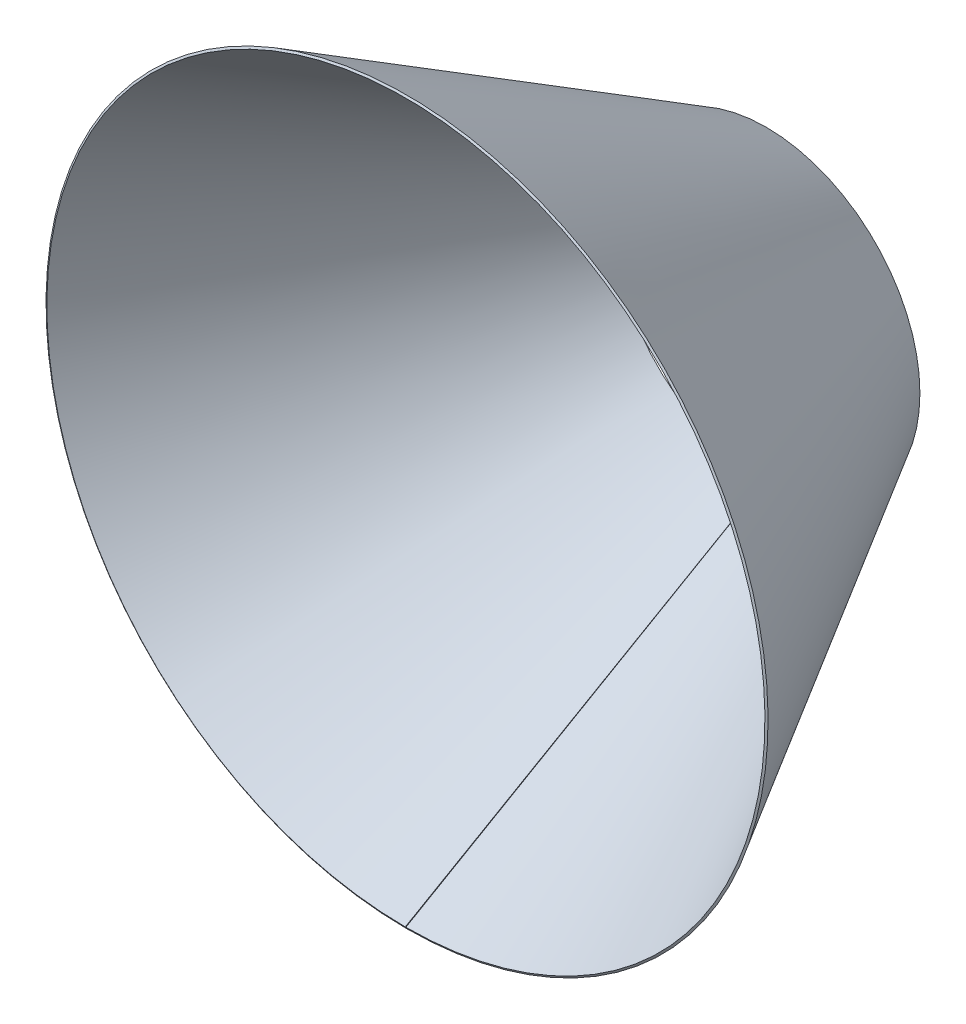
ISO-10303-21;
HEADER;
FILE_DESCRIPTION(('STEP AP214'),'2;1');
FILE_NAME('part.step','',(''),(''),'','','');
FILE_SCHEMA(('AUTOMOTIVE_DESIGN { 1 0 10303 214 1 1 1 1 }'));
ENDSEC;
DATA;
#1=APPLICATION_CONTEXT('core data for automotive mechanical design processes');
#2=APPLICATION_PROTOCOL_DEFINITION('international standard','automotive_design',2000,#1);
#3=PRODUCT_CONTEXT('',#1,'mechanical');
#4=PRODUCT('Part','Part','',(#3));
#5=PRODUCT_RELATED_PRODUCT_CATEGORY('part','',(#4));
#6=PRODUCT_DEFINITION_FORMATION('','',#4);
#7=PRODUCT_DEFINITION_CONTEXT('part definition',#1,'design');
#8=PRODUCT_DEFINITION('design','',#6,#7);
#9=PRODUCT_DEFINITION_SHAPE('','',#8);
#10=(LENGTH_UNIT() NAMED_UNIT(*) SI_UNIT(.MILLI.,.METRE.));
#11=(NAMED_UNIT(*) PLANE_ANGLE_UNIT() SI_UNIT($,.RADIAN.));
#12=(NAMED_UNIT(*) SI_UNIT($,.STERADIAN.) SOLID_ANGLE_UNIT());
#13=UNCERTAINTY_MEASURE_WITH_UNIT(LENGTH_MEASURE(1.E-05),#10,'distance_accuracy_value','');
#14=(GEOMETRIC_REPRESENTATION_CONTEXT(3) GLOBAL_UNCERTAINTY_ASSIGNED_CONTEXT((#13)) GLOBAL_UNIT_ASSIGNED_CONTEXT((#10,
#11,#12)) REPRESENTATION_CONTEXT('',''));
#15=CARTESIAN_POINT('',(0.,0.,0.));
#16=DIRECTION('',(0.,0.,1.));
#17=DIRECTION('',(1.,0.,0.));
#18=AXIS2_PLACEMENT_3D('',#15,#16,#17);
#19=CARTESIAN_POINT('',(0.,-150.4,150.515215177735));
#20=DIRECTION('',(-1.,0.,0.));
#21=DIRECTION('',(0.,0.500000000000001,-0.866025403784438));
#22=AXIS2_PLACEMENT_3D('',#19,#20,#21);
#23=PLANE('',#22);
#24=DIRECTION('',(0.,-0.866025403784438,-0.500000000000001));
#25=VECTOR('',#24,1.);
#26=CARTESIAN_POINT('',(0.,-150.4,150.515215177735));
#27=LINE('',#26,#25);
#28=CARTESIAN_POINT('',(0.,-150.4,150.515215177735));
#29=VERTEX_POINT('',#28);
#30=CARTESIAN_POINT('',(0.,-151.224889197105,150.038965177735));
#31=VERTEX_POINT('',#30);
#32=EDGE_CURVE('E12',#29,#31,#27,.T.);
#33=ORIENTED_EDGE('',*,*,#32,.F.);
#34=DIRECTION('',(0.,0.500000000000001,-0.866025403784438));
#35=VECTOR('',#34,1.);
#36=CARTESIAN_POINT('',(0.,-150.4,150.515215177735));
#37=LINE('',#36,#35);
#38=CARTESIAN_POINT('',(0.,-63.5,0.));
#39=VERTEX_POINT('',#38);
#40=EDGE_CURVE('E113',#29,#39,#37,.T.);
#41=ORIENTED_EDGE('',*,*,#40,.T.);
#42=DIRECTION('',(0.,-0.866025403784438,-0.500000000000001));
#43=VECTOR('',#42,1.);
#44=CARTESIAN_POINT('',(0.,-63.5,0.));
#45=LINE('',#44,#43);
#46=CARTESIAN_POINT('',(0.,-64.3248891971047,-0.476249999999984));
#47=VERTEX_POINT('',#46);
#48=EDGE_CURVE('E61',#39,#47,#45,.T.);
#49=ORIENTED_EDGE('',*,*,#48,.T.);
#50=DIRECTION('',(0.,-0.500000000000001,0.866025403784438));
#51=VECTOR('',#50,1.);
#52=CARTESIAN_POINT('',(0.,-151.224889197105,150.038965177735));
#53=LINE('',#52,#51);
#54=EDGE_CURVE('E121',#31,#47,#53,.F.);
#55=ORIENTED_EDGE('',*,*,#54,.F.);
#56=EDGE_LOOP('',(#33,#41,#49,#55));
#57=FACE_BOUND('',#56,.T.);
#58=ADVANCED_FACE('F52',(#57),#23,.T.);
#59=CARTESIAN_POINT('',(0.,0.,0.));
#60=DIRECTION('',(0.,0.,-1.));
#61=DIRECTION('',(-1.,0.,0.));
#62=AXIS2_PLACEMENT_3D('',#59,#60,#61);
#63=CONICAL_SURFACE('',#62,63.5,1.0471975511966);
#64=ORIENTED_EDGE('',*,*,#48,.F.);
#65=CARTESIAN_POINT('',(0.,0.,0.));
#66=DIRECTION('',(0.,0.,1.));
#67=DIRECTION('',(1.,0.,0.));
#68=AXIS2_PLACEMENT_3D('',#65,#66,#67);
#69=CIRCLE('',#68,63.5);
#70=CARTESIAN_POINT('',(-0.110828351234507,-63.4999032839938,0.));
#71=VERTEX_POINT('',#70);
#72=EDGE_CURVE('E112',#39,#71,#69,.T.);
#73=ORIENTED_EDGE('',*,*,#72,.T.);
#74=DIRECTION('',(-0.00151149870281302,-0.866024084752653,-0.500000000000001));
#75=VECTOR('',#74,1.);
#76=CARTESIAN_POINT('',(-0.110828351234507,-63.4999032839938,0.));
#77=LINE('',#76,#75);
#78=CARTESIAN_POINT('',(-0.112268053748977,-64.3247912247207,-0.476249999999984));
#79=VERTEX_POINT('',#78);
#80=EDGE_CURVE('E94',#71,#79,#77,.T.);
#81=ORIENTED_EDGE('',*,*,#80,.T.);
#82=CARTESIAN_POINT('',(0.,0.,-0.476249999999984));
#83=DIRECTION('',(0.,0.,1.));
#84=DIRECTION('',(1.,0.,0.));
#85=AXIS2_PLACEMENT_3D('',#82,#83,#84);
#86=CIRCLE('',#85,64.3248891971047);
#87=EDGE_CURVE('E127',#47,#79,#86,.T.);
#88=ORIENTED_EDGE('',*,*,#87,.F.);
#89=EDGE_LOOP('',(#64,#73,#81,#88));
#90=FACE_BOUND('',#89,.T.);
#91=ADVANCED_FACE('F111',(#90),#63,.F.);
#92=CARTESIAN_POINT('',(-0.26249738623102,-150.399770927759,150.515215177735));
#93=DIRECTION('',(-0.999998476913288,0.00174532836589774,0.));
#94=DIRECTION('',(0.000872664182948873,0.499999238456645,-0.866025403784438));
#95=AXIS2_PLACEMENT_3D('',#92,#93,#94);
#96=PLANE('',#95);
#97=ORIENTED_EDGE('',*,*,#80,.F.);
#98=DIRECTION('',(0.000872664182948873,0.499999238456645,-0.866025403784438));
#99=VECTOR('',#98,1.);
#100=CARTESIAN_POINT('',(-0.26249738623102,-150.399770927759,150.515215177735));
#101=LINE('',#100,#99);
#102=CARTESIAN_POINT('',(-0.26249738623102,-150.399770927759,150.515215177735));
#103=VERTEX_POINT('',#102);
#104=EDGE_CURVE('E100',#103,#71,#101,.T.);
#105=ORIENTED_EDGE('',*,*,#104,.F.);
#106=DIRECTION('',(-0.00151149870281302,-0.866024084752653,-0.500000000000001));
#107=VECTOR('',#106,1.);
#108=CARTESIAN_POINT('',(-0.26249738623102,-150.399770927759,150.515215177735));
#109=LINE('',#108,#107);
#110=CARTESIAN_POINT('',(-0.263937088745547,-151.224658868485,150.038965177735));
#111=VERTEX_POINT('',#110);
#112=EDGE_CURVE('E60',#103,#111,#109,.T.);
#113=ORIENTED_EDGE('',*,*,#112,.T.);
#114=DIRECTION('',(-0.000872664182949194,-0.499999238456645,0.866025403784438));
#115=VECTOR('',#114,1.);
#116=CARTESIAN_POINT('',(-0.263937088745547,-151.224658868485,150.038965177735));
#117=LINE('',#116,#115);
#118=EDGE_CURVE('E97',#111,#79,#117,.F.);
#119=ORIENTED_EDGE('',*,*,#118,.T.);
#120=EDGE_LOOP('',(#97,#105,#113,#119));
#121=FACE_BOUND('',#120,.T.);
#122=ADVANCED_FACE('F96',(#121),#96,.F.);
#123=CARTESIAN_POINT('',(0.,0.,150.515215177735));
#124=DIRECTION('',(0.,0.,-1.));
#125=DIRECTION('',(-1.,0.,0.));
#126=AXIS2_PLACEMENT_3D('',#123,#124,#125);
#127=CONICAL_SURFACE('',#126,150.4,1.0471975511966);
#128=CARTESIAN_POINT('',(0.,0.,150.515215177735));
#129=DIRECTION('',(0.,0.,1.));
#130=DIRECTION('',(1.,0.,0.));
#131=AXIS2_PLACEMENT_3D('',#128,#129,#130);
#132=CIRCLE('',#131,150.4);
#133=EDGE_CURVE('E115',#29,#103,#132,.T.);
#134=ORIENTED_EDGE('',*,*,#133,.F.);
#135=ORIENTED_EDGE('',*,*,#32,.T.);
#136=CARTESIAN_POINT('',(0.,0.,150.038965177735));
#137=DIRECTION('',(0.,0.,1.));
#138=DIRECTION('',(1.,0.,0.));
#139=AXIS2_PLACEMENT_3D('',#136,#137,#138);
#140=CIRCLE('',#139,151.224889197105);
#141=EDGE_CURVE('E120',#31,#111,#140,.T.);
#142=ORIENTED_EDGE('',*,*,#141,.T.);
#143=ORIENTED_EDGE('',*,*,#112,.F.);
#144=EDGE_LOOP('',(#134,#135,#142,#143));
#145=FACE_BOUND('',#144,.T.);
#146=ADVANCED_FACE('F54',(#145),#127,.T.);
#147=CARTESIAN_POINT('',(0.,0.,150.038965177735));
#148=DIRECTION('',(0.,0.,1.));
#149=DIRECTION('',(1.,0.,0.));
#150=AXIS2_PLACEMENT_3D('',#147,#148,#149);
#151=CONICAL_SURFACE('',#150,151.224889197105,0.5235987755983);
#152=ORIENTED_EDGE('',*,*,#118,.F.);
#153=ORIENTED_EDGE('',*,*,#141,.F.);
#154=ORIENTED_EDGE('',*,*,#54,.T.);
#155=ORIENTED_EDGE('',*,*,#87,.T.);
#156=EDGE_LOOP('',(#152,#153,#154,#155));
#157=FACE_BOUND('',#156,.T.);
#158=ADVANCED_FACE('F129',(#157),#151,.T.);
#159=CARTESIAN_POINT('',(0.,0.,150.515215177735));
#160=DIRECTION('',(0.,0.,1.));
#161=DIRECTION('',(1.,0.,0.));
#162=AXIS2_PLACEMENT_3D('',#159,#160,#161);
#163=CONICAL_SURFACE('',#162,150.4,0.5235987755983);
#164=ORIENTED_EDGE('',*,*,#104,.T.);
#165=ORIENTED_EDGE('',*,*,#72,.F.);
#166=ORIENTED_EDGE('',*,*,#40,.F.);
#167=ORIENTED_EDGE('',*,*,#133,.T.);
#168=EDGE_LOOP('',(#164,#165,#166,#167));
#169=FACE_BOUND('',#168,.T.);
#170=ADVANCED_FACE('F108',(#169),#163,.F.);
#171=CLOSED_SHELL('',(#58,#91,#122,#146,#158,#170));
#172=MANIFOLD_SOLID_BREP('B2',#171);
#173=ADVANCED_BREP_SHAPE_REPRESENTATION('',(#18,#172),#14);
#174=SHAPE_DEFINITION_REPRESENTATION(#9,#173);
ENDSEC;
END-ISO-10303-21;
